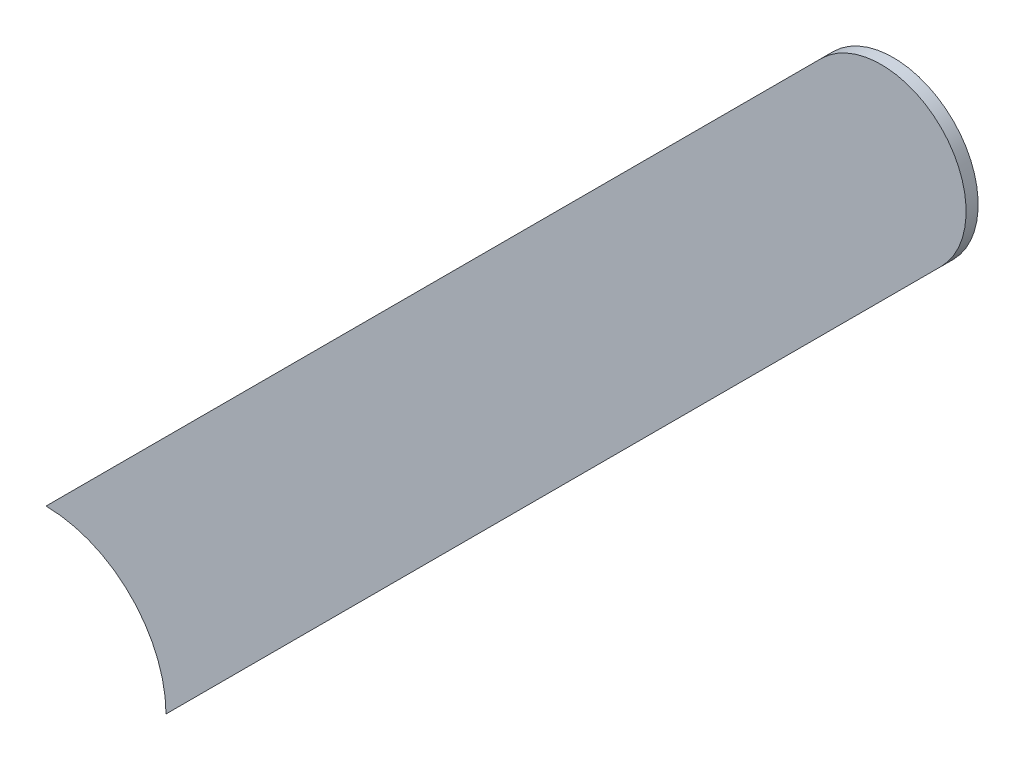
ISO-10303-21;
HEADER;
FILE_DESCRIPTION(('STEP AP214'),'2;1');
FILE_NAME('part.step','',(''),(''),'','','');
FILE_SCHEMA(('AUTOMOTIVE_DESIGN { 1 0 10303 214 1 1 1 1 }'));
ENDSEC;
DATA;
#1=APPLICATION_CONTEXT('core data for automotive mechanical design processes');
#2=APPLICATION_PROTOCOL_DEFINITION('international standard','automotive_design',2000,#1);
#3=PRODUCT_CONTEXT('',#1,'mechanical');
#4=PRODUCT('Part','Part','',(#3));
#5=PRODUCT_RELATED_PRODUCT_CATEGORY('part','',(#4));
#6=PRODUCT_DEFINITION_FORMATION('','',#4);
#7=PRODUCT_DEFINITION_CONTEXT('part definition',#1,'design');
#8=PRODUCT_DEFINITION('design','',#6,#7);
#9=PRODUCT_DEFINITION_SHAPE('','',#8);
#10=(LENGTH_UNIT() NAMED_UNIT(*) SI_UNIT(.MILLI.,.METRE.));
#11=(NAMED_UNIT(*) PLANE_ANGLE_UNIT() SI_UNIT($,.RADIAN.));
#12=(NAMED_UNIT(*) SI_UNIT($,.STERADIAN.) SOLID_ANGLE_UNIT());
#13=UNCERTAINTY_MEASURE_WITH_UNIT(LENGTH_MEASURE(1.E-05),#10,'distance_accuracy_value','');
#14=(GEOMETRIC_REPRESENTATION_CONTEXT(3) GLOBAL_UNCERTAINTY_ASSIGNED_CONTEXT((#13)) GLOBAL_UNIT_ASSIGNED_CONTEXT((#10,
#11,#12)) REPRESENTATION_CONTEXT('',''));
#15=CARTESIAN_POINT('',(0.,0.,0.));
#16=DIRECTION('',(0.,0.,1.));
#17=DIRECTION('',(1.,0.,0.));
#18=AXIS2_PLACEMENT_3D('',#15,#16,#17);
#19=CARTESIAN_POINT('',(86.2555950605108,95.5020408805108,0.));
#20=DIRECTION('',(-0.707106781186548,0.707106781186548,0.));
#21=DIRECTION('',(0.707106781186548,0.707106781186548,0.));
#22=AXIS2_PLACEMENT_3D('',#19,#20,#21);
#23=PLANE('',#22);
#24=DIRECTION('',(0.707106781186548,0.707106781186548,0.));
#25=VECTOR('',#24,1.);
#26=CARTESIAN_POINT('',(86.0767773,95.32322312,0.03556));
#27=LINE('',#26,#25);
#28=CARTESIAN_POINT('',(86.2555950605108,95.5020408805108,0.03556));
#29=VERTEX_POINT('',#28);
#30=CARTESIAN_POINT('',(88.53878914,97.78523496,0.03556));
#31=VERTEX_POINT('',#30);
#32=EDGE_CURVE('E11',#29,#31,#27,.T.);
#33=ORIENTED_EDGE('',*,*,#32,.F.);
#34=DIRECTION('',(0.,0.,1.));
#35=VECTOR('',#34,1.);
#36=CARTESIAN_POINT('',(86.2555950605108,95.5020408805108,0.));
#37=LINE('',#36,#35);
#38=CARTESIAN_POINT('',(86.2555950605108,95.5020408805108,0.));
#39=VERTEX_POINT('',#38);
#40=EDGE_CURVE('E24',#39,#29,#37,.T.);
#41=ORIENTED_EDGE('',*,*,#40,.F.);
#42=DIRECTION('',(0.707106781186548,0.707106781186548,0.));
#43=VECTOR('',#42,1.);
#44=CARTESIAN_POINT('',(86.0767773,95.32322312,0.));
#45=LINE('',#44,#43);
#46=CARTESIAN_POINT('',(88.53878914,97.78523496,0.));
#47=VERTEX_POINT('',#46);
#48=EDGE_CURVE('E75',#39,#47,#45,.T.);
#49=ORIENTED_EDGE('',*,*,#48,.T.);
#50=DIRECTION('',(0.,0.,1.));
#51=VECTOR('',#50,1.);
#52=CARTESIAN_POINT('',(88.53878914,97.78523496,0.));
#53=LINE('',#52,#51);
#54=EDGE_CURVE('E37',#47,#31,#53,.T.);
#55=ORIENTED_EDGE('',*,*,#54,.T.);
#56=EDGE_LOOP('',(#33,#41,#49,#55));
#57=FACE_BOUND('',#56,.T.);
#58=ADVANCED_FACE('F17',(#57),#23,.F.);
#59=CARTESIAN_POINT('',(88.36201276,97.96201134,0.));
#60=DIRECTION('',(0.,0.,-1.));
#61=DIRECTION('',(0.707106781186519,-0.707106781186576,0.));
#62=AXIS2_PLACEMENT_3D('',#59,#60,#61);
#63=CYLINDRICAL_SURFACE('',#62,0.249999554103216);
#64=CARTESIAN_POINT('',(88.36201276,97.96201134,0.03556));
#65=DIRECTION('',(0.,0.,1.));
#66=DIRECTION('',(0.707106781186519,-0.707106781186576,0.));
#67=AXIS2_PLACEMENT_3D('',#64,#65,#66);
#68=CIRCLE('',#67,0.249999554103216);
#69=CARTESIAN_POINT('',(88.18523638,98.13878772,0.03556));
#70=VERTEX_POINT('',#69);
#71=EDGE_CURVE('E83',#31,#70,#68,.T.);
#72=ORIENTED_EDGE('',*,*,#71,.F.);
#73=ORIENTED_EDGE('',*,*,#54,.F.);
#74=CARTESIAN_POINT('',(88.36201276,97.96201134,0.));
#75=DIRECTION('',(0.,0.,1.));
#76=DIRECTION('',(0.707106781186519,-0.707106781186576,0.));
#77=AXIS2_PLACEMENT_3D('',#74,#75,#76);
#78=CIRCLE('',#77,0.249999554103216);
#79=CARTESIAN_POINT('',(88.18523638,98.13878772,0.));
#80=VERTEX_POINT('',#79);
#81=EDGE_CURVE('E81',#47,#80,#78,.T.);
#82=ORIENTED_EDGE('',*,*,#81,.T.);
#83=DIRECTION('',(0.,0.,1.));
#84=VECTOR('',#83,1.);
#85=CARTESIAN_POINT('',(88.18523638,98.13878772,0.));
#86=LINE('',#85,#84);
#87=EDGE_CURVE('E67',#80,#70,#86,.T.);
#88=ORIENTED_EDGE('',*,*,#87,.T.);
#89=EDGE_LOOP('',(#72,#73,#82,#88));
#90=FACE_BOUND('',#89,.T.);
#91=ADVANCED_FACE('F89',(#90),#63,.T.);
#92=CARTESIAN_POINT('',(88.18523638,98.13878772,0.));
#93=DIRECTION('',(0.70710678118655,-0.707106781186545,0.));
#94=DIRECTION('',(-0.707106781186545,-0.70710678118655,0.));
#95=AXIS2_PLACEMENT_3D('',#92,#93,#94);
#96=PLANE('',#95);
#97=DIRECTION('',(-0.707106781186545,-0.70710678118655,0.));
#98=VECTOR('',#97,1.);
#99=CARTESIAN_POINT('',(88.18523638,98.13878772,0.03556));
#100=LINE('',#99,#98);
#101=CARTESIAN_POINT('',(85.9020423005108,95.8555936405108,0.03556));
#102=VERTEX_POINT('',#101);
#103=EDGE_CURVE('E71',#70,#102,#100,.T.);
#104=ORIENTED_EDGE('',*,*,#103,.F.);
#105=ORIENTED_EDGE('',*,*,#87,.F.);
#106=DIRECTION('',(-0.707106781186545,-0.70710678118655,0.));
#107=VECTOR('',#106,1.);
#108=CARTESIAN_POINT('',(88.18523638,98.13878772,0.));
#109=LINE('',#108,#107);
#110=CARTESIAN_POINT('',(85.9020423005108,95.8555936405108,0.));
#111=VERTEX_POINT('',#110);
#112=EDGE_CURVE('E63',#80,#111,#109,.T.);
#113=ORIENTED_EDGE('',*,*,#112,.T.);
#114=DIRECTION('',(0.,0.,1.));
#115=VECTOR('',#114,1.);
#116=CARTESIAN_POINT('',(85.9020423005108,95.8555936405108,0.));
#117=LINE('',#116,#115);
#118=EDGE_CURVE('E53',#111,#102,#117,.T.);
#119=ORIENTED_EDGE('',*,*,#118,.T.);
#120=EDGE_LOOP('',(#104,#105,#113,#119));
#121=FACE_BOUND('',#120,.T.);
#122=ADVANCED_FACE('F66',(#121),#96,.F.);
#123=CARTESIAN_POINT('',(85.90000092,95.4999995,0.));
#124=DIRECTION('',(0.,0.,-1.));
#125=DIRECTION('',(1.,0.,0.));
#126=AXIS2_PLACEMENT_3D('',#123,#124,#125);
#127=CYLINDRICAL_SURFACE('',#126,0.3556);
#128=ORIENTED_EDGE('',*,*,#40,.T.);
#129=CARTESIAN_POINT('',(85.90000092,95.4999995,0.03556));
#130=DIRECTION('',(0.,0.,1.));
#131=DIRECTION('',(1.,0.,0.));
#132=AXIS2_PLACEMENT_3D('',#129,#130,#131);
#133=CIRCLE('',#132,0.3556);
#134=EDGE_CURVE('E59',#29,#102,#133,.T.);
#135=ORIENTED_EDGE('',*,*,#134,.T.);
#136=ORIENTED_EDGE('',*,*,#118,.F.);
#137=CARTESIAN_POINT('',(85.90000092,95.4999995,0.));
#138=DIRECTION('',(0.,0.,1.));
#139=DIRECTION('',(1.,0.,0.));
#140=AXIS2_PLACEMENT_3D('',#137,#138,#139);
#141=CIRCLE('',#140,0.3556);
#142=EDGE_CURVE('E57',#39,#111,#141,.T.);
#143=ORIENTED_EDGE('',*,*,#142,.F.);
#144=EDGE_LOOP('',(#128,#135,#136,#143));
#145=FACE_BOUND('',#144,.T.);
#146=ADVANCED_FACE('F55',(#145),#127,.F.);
#147=CARTESIAN_POINT('',(86.0767773,95.32322312,0.));
#148=DIRECTION('',(0.,0.,-1.));
#149=DIRECTION('',(-1.,0.,0.));
#150=AXIS2_PLACEMENT_3D('',#147,#148,#149);
#151=PLANE('',#150);
#152=ORIENTED_EDGE('',*,*,#48,.F.);
#153=ORIENTED_EDGE('',*,*,#142,.T.);
#154=ORIENTED_EDGE('',*,*,#112,.F.);
#155=ORIENTED_EDGE('',*,*,#81,.F.);
#156=EDGE_LOOP('',(#152,#153,#154,#155));
#157=FACE_BOUND('',#156,.T.);
#158=ADVANCED_FACE('F74',(#157),#151,.T.);
#159=CARTESIAN_POINT('',(86.0767773,95.32322312,0.03556));
#160=DIRECTION('',(0.,0.,-1.));
#161=DIRECTION('',(-1.,0.,0.));
#162=AXIS2_PLACEMENT_3D('',#159,#160,#161);
#163=PLANE('',#162);
#164=ORIENTED_EDGE('',*,*,#134,.F.);
#165=ORIENTED_EDGE('',*,*,#32,.T.);
#166=ORIENTED_EDGE('',*,*,#71,.T.);
#167=ORIENTED_EDGE('',*,*,#103,.T.);
#168=EDGE_LOOP('',(#164,#165,#166,#167));
#169=FACE_BOUND('',#168,.T.);
#170=ADVANCED_FACE('F91',(#169),#163,.F.);
#171=CLOSED_SHELL('',(#58,#91,#122,#146,#158,#170));
#172=MANIFOLD_SOLID_BREP('B1',#171);
#173=ADVANCED_BREP_SHAPE_REPRESENTATION('',(#18,#172),#14);
#174=SHAPE_DEFINITION_REPRESENTATION(#9,#173);
ENDSEC;
END-ISO-10303-21;
